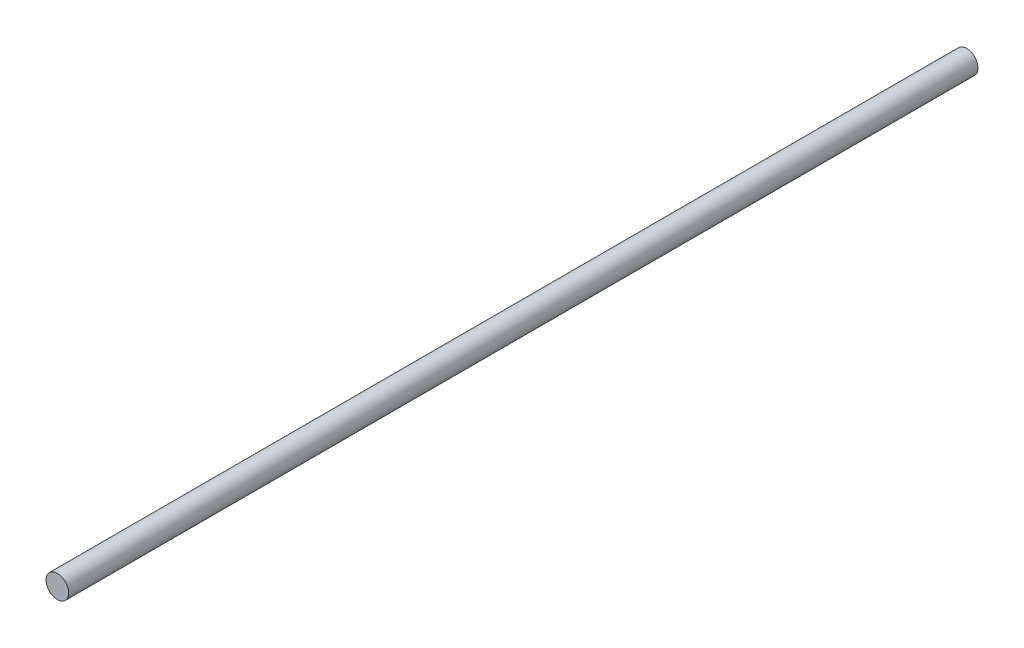
ISO-10303-21;
HEADER;
FILE_DESCRIPTION(('STEP AP214'),'2;1');
FILE_NAME('part.step','',(''),(''),'','','');
FILE_SCHEMA(('AUTOMOTIVE_DESIGN { 1 0 10303 214 1 1 1 1 }'));
ENDSEC;
DATA;
#1=APPLICATION_CONTEXT('core data for automotive mechanical design processes');
#2=APPLICATION_PROTOCOL_DEFINITION('international standard','automotive_design',2000,#1);
#3=PRODUCT_CONTEXT('',#1,'mechanical');
#4=PRODUCT('Part','Part','',(#3));
#5=PRODUCT_RELATED_PRODUCT_CATEGORY('part','',(#4));
#6=PRODUCT_DEFINITION_FORMATION('','',#4);
#7=PRODUCT_DEFINITION_CONTEXT('part definition',#1,'design');
#8=PRODUCT_DEFINITION('design','',#6,#7);
#9=PRODUCT_DEFINITION_SHAPE('','',#8);
#10=(LENGTH_UNIT() NAMED_UNIT(*) SI_UNIT(.MILLI.,.METRE.));
#11=(NAMED_UNIT(*) PLANE_ANGLE_UNIT() SI_UNIT($,.RADIAN.));
#12=(NAMED_UNIT(*) SI_UNIT($,.STERADIAN.) SOLID_ANGLE_UNIT());
#13=UNCERTAINTY_MEASURE_WITH_UNIT(LENGTH_MEASURE(1.E-05),#10,'distance_accuracy_value','');
#14=(GEOMETRIC_REPRESENTATION_CONTEXT(3) GLOBAL_UNCERTAINTY_ASSIGNED_CONTEXT((#13)) GLOBAL_UNIT_ASSIGNED_CONTEXT((#10,
#11,#12)) REPRESENTATION_CONTEXT('',''));
#15=CARTESIAN_POINT('',(0.,0.,0.));
#16=DIRECTION('',(0.,0.,1.));
#17=DIRECTION('',(1.,0.,0.));
#18=AXIS2_PLACEMENT_3D('',#15,#16,#17);
#19=CARTESIAN_POINT('',(0.,0.,80.));
#20=DIRECTION('',(0.,0.,-1.));
#21=DIRECTION('',(-1.,0.,0.));
#22=AXIS2_PLACEMENT_3D('',#19,#20,#21);
#23=CYLINDRICAL_SURFACE('',#22,1.);
#24=CARTESIAN_POINT('',(0.,0.,80.));
#25=DIRECTION('',(0.,0.,1.));
#26=DIRECTION('',(1.,0.,0.));
#27=AXIS2_PLACEMENT_3D('',#24,#25,#26);
#28=CIRCLE('',#27,1.);
#29=CARTESIAN_POINT('',(1.,0.,80.));
#30=VERTEX_POINT('',#29);
#31=EDGE_CURVE('E10',#30,#30,#28,.T.);
#32=ORIENTED_EDGE('',*,*,#31,.F.);
#33=EDGE_LOOP('',(#32));
#34=FACE_BOUND('',#33,.T.);
#35=CARTESIAN_POINT('',(0.,0.,0.));
#36=DIRECTION('',(0.,0.,1.));
#37=DIRECTION('',(1.,0.,0.));
#38=AXIS2_PLACEMENT_3D('',#35,#36,#37);
#39=CIRCLE('',#38,1.);
#40=CARTESIAN_POINT('',(1.,0.,0.));
#41=VERTEX_POINT('',#40);
#42=EDGE_CURVE('E40',#41,#41,#39,.T.);
#43=ORIENTED_EDGE('',*,*,#42,.T.);
#44=EDGE_LOOP('',(#43));
#45=FACE_BOUND('',#44,.T.);
#46=ADVANCED_FACE('F37',(#34,#45),#23,.T.);
#47=CARTESIAN_POINT('',(0.,0.,80.));
#48=DIRECTION('',(0.,0.,1.));
#49=DIRECTION('',(1.,0.,0.));
#50=AXIS2_PLACEMENT_3D('',#47,#48,#49);
#51=PLANE('',#50);
#52=ORIENTED_EDGE('',*,*,#31,.T.);
#53=EDGE_LOOP('',(#52));
#54=FACE_BOUND('',#53,.T.);
#55=ADVANCED_FACE('F54',(#54),#51,.T.);
#56=CARTESIAN_POINT('',(0.,0.,0.));
#57=DIRECTION('',(0.,0.,1.));
#58=DIRECTION('',(1.,0.,0.));
#59=AXIS2_PLACEMENT_3D('',#56,#57,#58);
#60=PLANE('',#59);
#61=ORIENTED_EDGE('',*,*,#42,.F.);
#62=EDGE_LOOP('',(#61));
#63=FACE_BOUND('',#62,.T.);
#64=ADVANCED_FACE('F52',(#63),#60,.F.);
#65=CLOSED_SHELL('',(#46,#55,#64));
#66=MANIFOLD_SOLID_BREP('B2',#65);
#67=ADVANCED_BREP_SHAPE_REPRESENTATION('',(#18,#66),#14);
#68=SHAPE_DEFINITION_REPRESENTATION(#9,#67);
ENDSEC;
END-ISO-10303-21;
